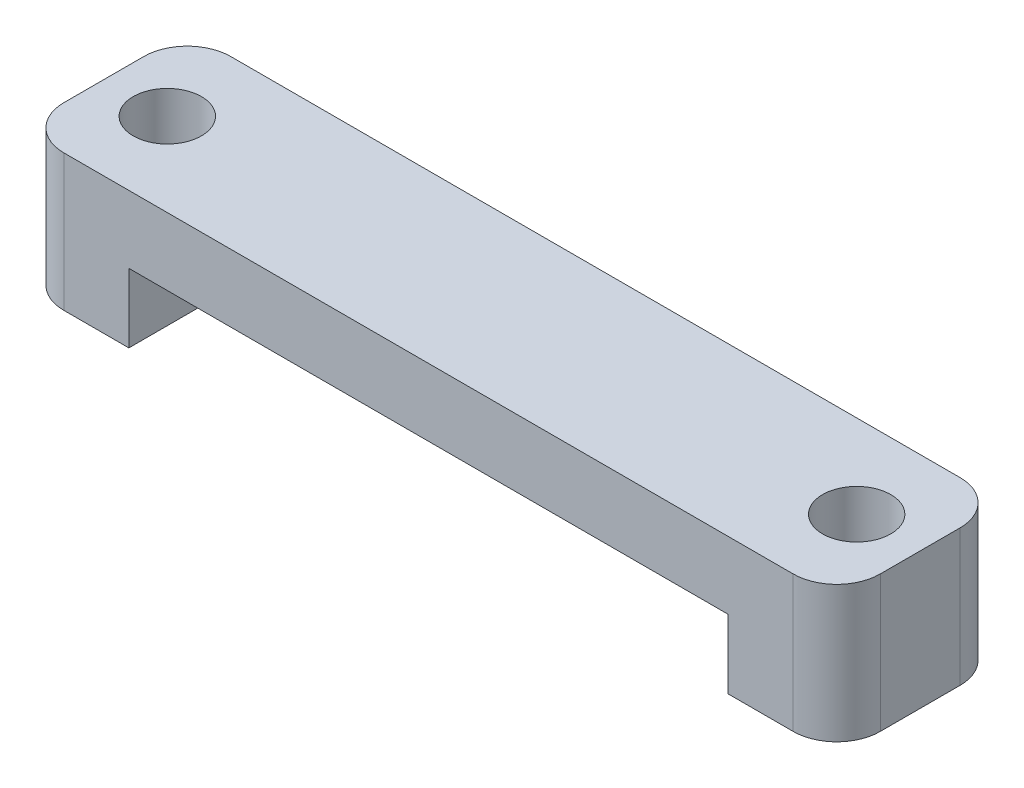
ISO-10303-21;
HEADER;
FILE_DESCRIPTION(('STEP AP214'),'2;1');
FILE_NAME('part.step','',(''),(''),'','','');
FILE_SCHEMA(('AUTOMOTIVE_DESIGN { 1 0 10303 214 1 1 1 1 }'));
ENDSEC;
DATA;
#1=APPLICATION_CONTEXT('core data for automotive mechanical design processes');
#2=APPLICATION_PROTOCOL_DEFINITION('international standard','automotive_design',2000,#1);
#3=PRODUCT_CONTEXT('',#1,'mechanical');
#4=PRODUCT('Part','Part','',(#3));
#5=PRODUCT_RELATED_PRODUCT_CATEGORY('part','',(#4));
#6=PRODUCT_DEFINITION_FORMATION('','',#4);
#7=PRODUCT_DEFINITION_CONTEXT('part definition',#1,'design');
#8=PRODUCT_DEFINITION('design','',#6,#7);
#9=PRODUCT_DEFINITION_SHAPE('','',#8);
#10=(LENGTH_UNIT() NAMED_UNIT(*) SI_UNIT(.MILLI.,.METRE.));
#11=(NAMED_UNIT(*) PLANE_ANGLE_UNIT() SI_UNIT($,.RADIAN.));
#12=(NAMED_UNIT(*) SI_UNIT($,.STERADIAN.) SOLID_ANGLE_UNIT());
#13=UNCERTAINTY_MEASURE_WITH_UNIT(LENGTH_MEASURE(1.E-05),#10,'distance_accuracy_value','');
#14=(GEOMETRIC_REPRESENTATION_CONTEXT(3) GLOBAL_UNCERTAINTY_ASSIGNED_CONTEXT((#13)) GLOBAL_UNIT_ASSIGNED_CONTEXT((#10,
#11,#12)) REPRESENTATION_CONTEXT('',''));
#15=CARTESIAN_POINT('',(0.,0.,0.));
#16=DIRECTION('',(0.,0.,1.));
#17=DIRECTION('',(1.,0.,0.));
#18=AXIS2_PLACEMENT_3D('',#15,#16,#17);
#19=CARTESIAN_POINT('',(-14.2875,0.,2.921));
#20=DIRECTION('',(0.,1.,0.));
#21=DIRECTION('',(0.,0.,1.));
#22=AXIS2_PLACEMENT_3D('',#19,#20,#21);
#23=PLANE('',#22);
#24=CARTESIAN_POINT('',(-12.065,0.,0.));
#25=DIRECTION('',(0.,1.,0.));
#26=DIRECTION('',(0.,0.,1.));
#27=AXIS2_PLACEMENT_3D('',#24,#25,#26);
#28=CIRCLE('',#27,1.1938);
#29=CARTESIAN_POINT('',(-12.065,0.,1.1938));
#30=VERTEX_POINT('',#29);
#31=EDGE_CURVE('E210',#30,#30,#28,.T.);
#32=ORIENTED_EDGE('',*,*,#31,.T.);
#33=EDGE_LOOP('',(#32));
#34=FACE_BOUND('',#33,.T.);
#35=DIRECTION('',(-1.,0.,0.));
#36=VECTOR('',#35,1.);
#37=CARTESIAN_POINT('',(-14.2875,0.,-2.921));
#38=LINE('',#37,#36);
#39=CARTESIAN_POINT('',(-10.4902,0.,-2.921));
#40=VERTEX_POINT('',#39);
#41=CARTESIAN_POINT('',(-12.7635,0.,-2.921));
#42=VERTEX_POINT('',#41);
#43=EDGE_CURVE('E139',#40,#42,#38,.T.);
#44=ORIENTED_EDGE('',*,*,#43,.F.);
#45=DIRECTION('',(0.,0.,1.));
#46=VECTOR('',#45,1.);
#47=CARTESIAN_POINT('',(-10.4902,0.,-2.921));
#48=LINE('',#47,#46);
#49=CARTESIAN_POINT('',(-10.4902,0.,2.921));
#50=VERTEX_POINT('',#49);
#51=EDGE_CURVE('E126',#40,#50,#48,.T.);
#52=ORIENTED_EDGE('',*,*,#51,.T.);
#53=DIRECTION('',(1.,0.,0.));
#54=VECTOR('',#53,1.);
#55=CARTESIAN_POINT('',(-14.2875,0.,2.921));
#56=LINE('',#55,#54);
#57=CARTESIAN_POINT('',(-12.7635,0.,2.921));
#58=VERTEX_POINT('',#57);
#59=EDGE_CURVE('E137',#58,#50,#56,.T.);
#60=ORIENTED_EDGE('',*,*,#59,.F.);
#61=CARTESIAN_POINT('',(-12.7635,0.,1.397));
#62=DIRECTION('',(0.,1.,0.));
#63=DIRECTION('',(0.,0.,1.));
#64=AXIS2_PLACEMENT_3D('',#61,#62,#63);
#65=CIRCLE('',#64,1.524);
#66=CARTESIAN_POINT('',(-14.2875,0.,1.397));
#67=VERTEX_POINT('',#66);
#68=EDGE_CURVE('E166',#58,#67,#65,.F.);
#69=ORIENTED_EDGE('',*,*,#68,.T.);
#70=DIRECTION('',(0.,0.,1.));
#71=VECTOR('',#70,1.);
#72=CARTESIAN_POINT('',(-14.2875,0.,-2.921));
#73=LINE('',#72,#71);
#74=CARTESIAN_POINT('',(-14.2875,0.,-1.397));
#75=VERTEX_POINT('',#74);
#76=EDGE_CURVE('E149',#75,#67,#73,.T.);
#77=ORIENTED_EDGE('',*,*,#76,.F.);
#78=CARTESIAN_POINT('',(-12.7635,0.,-1.397));
#79=DIRECTION('',(0.,1.,0.));
#80=DIRECTION('',(0.,0.,1.));
#81=AXIS2_PLACEMENT_3D('',#78,#79,#80);
#82=CIRCLE('',#81,1.524);
#83=EDGE_CURVE('E168',#75,#42,#82,.F.);
#84=ORIENTED_EDGE('',*,*,#83,.T.);
#85=EDGE_LOOP('',(#44,#52,#60,#69,#77,#84));
#86=FACE_BOUND('',#85,.T.);
#87=ADVANCED_FACE('F34',(#34,#86),#23,.F.);
#88=CARTESIAN_POINT('',(-14.2875,4.7752,2.921));
#89=DIRECTION('',(0.,1.,0.));
#90=DIRECTION('',(0.,0.,1.));
#91=AXIS2_PLACEMENT_3D('',#88,#89,#90);
#92=PLANE('',#91);
#93=CARTESIAN_POINT('',(12.065,4.7752,0.));
#94=DIRECTION('',(0.,1.,0.));
#95=DIRECTION('',(0.,0.,1.));
#96=AXIS2_PLACEMENT_3D('',#93,#94,#95);
#97=CIRCLE('',#96,1.1938);
#98=CARTESIAN_POINT('',(12.065,4.7752,1.1938));
#99=VERTEX_POINT('',#98);
#100=EDGE_CURVE('E200',#99,#99,#97,.T.);
#101=ORIENTED_EDGE('',*,*,#100,.F.);
#102=EDGE_LOOP('',(#101));
#103=FACE_BOUND('',#102,.T.);
#104=DIRECTION('',(0.,0.,-1.));
#105=VECTOR('',#104,1.);
#106=CARTESIAN_POINT('',(14.2875,4.7752,-2.921));
#107=LINE('',#106,#105);
#108=CARTESIAN_POINT('',(14.2875,4.7752,1.397));
#109=VERTEX_POINT('',#108);
#110=CARTESIAN_POINT('',(14.2875,4.7752,-1.397));
#111=VERTEX_POINT('',#110);
#112=EDGE_CURVE('E216',#109,#111,#107,.T.);
#113=ORIENTED_EDGE('',*,*,#112,.T.);
#114=CARTESIAN_POINT('',(12.7635,4.7752,-1.397));
#115=DIRECTION('',(0.,1.,0.));
#116=DIRECTION('',(0.,0.,1.));
#117=AXIS2_PLACEMENT_3D('',#114,#115,#116);
#118=CIRCLE('',#117,1.524);
#119=CARTESIAN_POINT('',(12.7635,4.7752,-2.921));
#120=VERTEX_POINT('',#119);
#121=EDGE_CURVE('E183',#111,#120,#118,.T.);
#122=ORIENTED_EDGE('',*,*,#121,.T.);
#123=DIRECTION('',(-1.,0.,0.));
#124=VECTOR('',#123,1.);
#125=CARTESIAN_POINT('',(-14.2875,4.7752,-2.921));
#126=LINE('',#125,#124);
#127=CARTESIAN_POINT('',(-12.7635,4.7752,-2.921));
#128=VERTEX_POINT('',#127);
#129=EDGE_CURVE('E160',#120,#128,#126,.T.);
#130=ORIENTED_EDGE('',*,*,#129,.T.);
#131=CARTESIAN_POINT('',(-12.7635,4.7752,-1.397));
#132=DIRECTION('',(0.,1.,0.));
#133=DIRECTION('',(0.,0.,1.));
#134=AXIS2_PLACEMENT_3D('',#131,#132,#133);
#135=CIRCLE('',#134,1.524);
#136=CARTESIAN_POINT('',(-14.2875,4.7752,-1.397));
#137=VERTEX_POINT('',#136);
#138=EDGE_CURVE('E181',#128,#137,#135,.T.);
#139=ORIENTED_EDGE('',*,*,#138,.T.);
#140=DIRECTION('',(0.,0.,1.));
#141=VECTOR('',#140,1.);
#142=CARTESIAN_POINT('',(-14.2875,4.7752,-2.921));
#143=LINE('',#142,#141);
#144=CARTESIAN_POINT('',(-14.2875,4.7752,1.397));
#145=VERTEX_POINT('',#144);
#146=EDGE_CURVE('E156',#137,#145,#143,.T.);
#147=ORIENTED_EDGE('',*,*,#146,.T.);
#148=CARTESIAN_POINT('',(-12.7635,4.7752,1.397));
#149=DIRECTION('',(0.,1.,0.));
#150=DIRECTION('',(0.,0.,1.));
#151=AXIS2_PLACEMENT_3D('',#148,#149,#150);
#152=CIRCLE('',#151,1.524);
#153=CARTESIAN_POINT('',(-12.7635,4.7752,2.921));
#154=VERTEX_POINT('',#153);
#155=EDGE_CURVE('E179',#145,#154,#152,.T.);
#156=ORIENTED_EDGE('',*,*,#155,.T.);
#157=DIRECTION('',(1.,0.,0.));
#158=VECTOR('',#157,1.);
#159=CARTESIAN_POINT('',(-14.2875,4.7752,2.921));
#160=LINE('',#159,#158);
#161=CARTESIAN_POINT('',(12.7635,4.7752,2.921));
#162=VERTEX_POINT('',#161);
#163=EDGE_CURVE('E214',#154,#162,#160,.T.);
#164=ORIENTED_EDGE('',*,*,#163,.T.);
#165=CARTESIAN_POINT('',(12.7635,4.7752,1.397));
#166=DIRECTION('',(0.,1.,0.));
#167=DIRECTION('',(0.,0.,1.));
#168=AXIS2_PLACEMENT_3D('',#165,#166,#167);
#169=CIRCLE('',#168,1.524);
#170=EDGE_CURVE('E177',#162,#109,#169,.T.);
#171=ORIENTED_EDGE('',*,*,#170,.T.);
#172=EDGE_LOOP('',(#113,#122,#130,#139,#147,#156,#164,#171));
#173=FACE_BOUND('',#172,.T.);
#174=CARTESIAN_POINT('',(-12.065,4.7752,0.));
#175=DIRECTION('',(0.,1.,0.));
#176=DIRECTION('',(0.,0.,1.));
#177=AXIS2_PLACEMENT_3D('',#174,#175,#176);
#178=CIRCLE('',#177,1.1938);
#179=CARTESIAN_POINT('',(-12.065,4.7752,1.1938));
#180=VERTEX_POINT('',#179);
#181=EDGE_CURVE('E207',#180,#180,#178,.T.);
#182=ORIENTED_EDGE('',*,*,#181,.F.);
#183=EDGE_LOOP('',(#182));
#184=FACE_BOUND('',#183,.T.);
#185=ADVANCED_FACE('F221',(#103,#173,#184),#92,.T.);
#186=CARTESIAN_POINT('',(12.065,0.,0.));
#187=DIRECTION('',(0.,1.,0.));
#188=DIRECTION('',(0.,0.,1.));
#189=AXIS2_PLACEMENT_3D('',#186,#187,#188);
#190=CIRCLE('',#189,1.1938);
#191=CARTESIAN_POINT('',(12.065,0.,1.1938));
#192=VERTEX_POINT('',#191);
#193=EDGE_CURVE('E202',#192,#192,#190,.T.);
#194=ORIENTED_EDGE('',*,*,#193,.T.);
#195=EDGE_LOOP('',(#194));
#196=FACE_BOUND('',#195,.T.);
#197=CARTESIAN_POINT('',(10.4902,0.,2.921));
#198=VERTEX_POINT('',#197);
#199=CARTESIAN_POINT('',(12.7635,0.,2.921));
#200=VERTEX_POINT('',#199);
#201=EDGE_CURVE('E145',#198,#200,#56,.T.);
#202=ORIENTED_EDGE('',*,*,#201,.F.);
#203=DIRECTION('',(0.,0.,1.));
#204=VECTOR('',#203,1.);
#205=CARTESIAN_POINT('',(10.4902,0.,-2.921));
#206=LINE('',#205,#204);
#207=CARTESIAN_POINT('',(10.4902,0.,-2.921));
#208=VERTEX_POINT('',#207);
#209=EDGE_CURVE('E140',#208,#198,#206,.T.);
#210=ORIENTED_EDGE('',*,*,#209,.F.);
#211=CARTESIAN_POINT('',(12.7635,0.,-2.921));
#212=VERTEX_POINT('',#211);
#213=EDGE_CURVE('E153',#212,#208,#38,.T.);
#214=ORIENTED_EDGE('',*,*,#213,.F.);
#215=CARTESIAN_POINT('',(12.7635,0.,-1.397));
#216=DIRECTION('',(0.,1.,0.));
#217=DIRECTION('',(0.,0.,1.));
#218=AXIS2_PLACEMENT_3D('',#215,#216,#217);
#219=CIRCLE('',#218,1.524);
#220=CARTESIAN_POINT('',(14.2875,0.,-1.397));
#221=VERTEX_POINT('',#220);
#222=EDGE_CURVE('E170',#212,#221,#219,.F.);
#223=ORIENTED_EDGE('',*,*,#222,.T.);
#224=DIRECTION('',(0.,0.,-1.));
#225=VECTOR('',#224,1.);
#226=CARTESIAN_POINT('',(14.2875,0.,-2.921));
#227=LINE('',#226,#225);
#228=CARTESIAN_POINT('',(14.2875,0.,1.397));
#229=VERTEX_POINT('',#228);
#230=EDGE_CURVE('E144',#229,#221,#227,.T.);
#231=ORIENTED_EDGE('',*,*,#230,.F.);
#232=CARTESIAN_POINT('',(12.7635,0.,1.397));
#233=DIRECTION('',(0.,1.,0.));
#234=DIRECTION('',(0.,0.,1.));
#235=AXIS2_PLACEMENT_3D('',#232,#233,#234);
#236=CIRCLE('',#235,1.524);
#237=EDGE_CURVE('E163',#229,#200,#236,.F.);
#238=ORIENTED_EDGE('',*,*,#237,.T.);
#239=EDGE_LOOP('',(#202,#210,#214,#223,#231,#238));
#240=FACE_BOUND('',#239,.T.);
#241=ADVANCED_FACE('F263',(#196,#240),#23,.F.);
#242=CARTESIAN_POINT('',(-14.2875,4.7752,-2.921));
#243=DIRECTION('',(1.,0.,0.));
#244=DIRECTION('',(0.,0.,-1.));
#245=AXIS2_PLACEMENT_3D('',#242,#243,#244);
#246=PLANE('',#245);
#247=ORIENTED_EDGE('',*,*,#146,.F.);
#248=DIRECTION('',(0.,-1.,0.));
#249=VECTOR('',#248,1.);
#250=CARTESIAN_POINT('',(-14.2875,4.7752,-1.397));
#251=LINE('',#250,#249);
#252=EDGE_CURVE('E187',#137,#75,#251,.T.);
#253=ORIENTED_EDGE('',*,*,#252,.T.);
#254=ORIENTED_EDGE('',*,*,#76,.T.);
#255=DIRECTION('',(0.,-1.,0.));
#256=VECTOR('',#255,1.);
#257=CARTESIAN_POINT('',(-14.2875,4.7752,1.397));
#258=LINE('',#257,#256);
#259=EDGE_CURVE('E185',#67,#145,#258,.F.);
#260=ORIENTED_EDGE('',*,*,#259,.T.);
#261=EDGE_LOOP('',(#247,#253,#254,#260));
#262=FACE_BOUND('',#261,.T.);
#263=ADVANCED_FACE('F194',(#262),#246,.F.);
#264=CARTESIAN_POINT('',(-14.2875,4.7752,2.921));
#265=DIRECTION('',(0.,0.,-1.));
#266=DIRECTION('',(-1.,0.,0.));
#267=AXIS2_PLACEMENT_3D('',#264,#265,#266);
#268=PLANE('',#267);
#269=ORIENTED_EDGE('',*,*,#59,.T.);
#270=DIRECTION('',(0.,-1.,0.));
#271=VECTOR('',#270,1.);
#272=CARTESIAN_POINT('',(-10.4902,2.413,2.921));
#273=LINE('',#272,#271);
#274=CARTESIAN_POINT('',(-10.4902,2.413,2.921));
#275=VERTEX_POINT('',#274);
#276=EDGE_CURVE('E122',#275,#50,#273,.T.);
#277=ORIENTED_EDGE('',*,*,#276,.F.);
#278=DIRECTION('',(-1.,0.,0.));
#279=VECTOR('',#278,1.);
#280=CARTESIAN_POINT('',(-10.4902,2.413,2.921));
#281=LINE('',#280,#279);
#282=CARTESIAN_POINT('',(10.4902,2.413,2.921));
#283=VERTEX_POINT('',#282);
#284=EDGE_CURVE('E231',#283,#275,#281,.T.);
#285=ORIENTED_EDGE('',*,*,#284,.F.);
#286=DIRECTION('',(0.,1.,0.));
#287=VECTOR('',#286,1.);
#288=CARTESIAN_POINT('',(10.4902,2.413,2.921));
#289=LINE('',#288,#287);
#290=EDGE_CURVE('E132',#198,#283,#289,.T.);
#291=ORIENTED_EDGE('',*,*,#290,.F.);
#292=ORIENTED_EDGE('',*,*,#201,.T.);
#293=DIRECTION('',(0.,-1.,0.));
#294=VECTOR('',#293,1.);
#295=CARTESIAN_POINT('',(12.7635,4.7752,2.921));
#296=LINE('',#295,#294);
#297=EDGE_CURVE('E42',#200,#162,#296,.F.);
#298=ORIENTED_EDGE('',*,*,#297,.T.);
#299=ORIENTED_EDGE('',*,*,#163,.F.);
#300=DIRECTION('',(0.,-1.,0.));
#301=VECTOR('',#300,1.);
#302=CARTESIAN_POINT('',(-12.7635,4.7752,2.921));
#303=LINE('',#302,#301);
#304=EDGE_CURVE('E11',#154,#58,#303,.T.);
#305=ORIENTED_EDGE('',*,*,#304,.T.);
#306=EDGE_LOOP('',(#269,#277,#285,#291,#292,#298,#299,#305));
#307=FACE_BOUND('',#306,.T.);
#308=ADVANCED_FACE('F142',(#307),#268,.F.);
#309=CARTESIAN_POINT('',(14.2875,4.7752,-2.921));
#310=DIRECTION('',(-1.,0.,0.));
#311=DIRECTION('',(0.,0.,1.));
#312=AXIS2_PLACEMENT_3D('',#309,#310,#311);
#313=PLANE('',#312);
#314=ORIENTED_EDGE('',*,*,#230,.T.);
#315=DIRECTION('',(0.,-1.,0.));
#316=VECTOR('',#315,1.);
#317=CARTESIAN_POINT('',(14.2875,4.7752,-1.397));
#318=LINE('',#317,#316);
#319=EDGE_CURVE('E175',#221,#111,#318,.F.);
#320=ORIENTED_EDGE('',*,*,#319,.T.);
#321=ORIENTED_EDGE('',*,*,#112,.F.);
#322=DIRECTION('',(0.,-1.,0.));
#323=VECTOR('',#322,1.);
#324=CARTESIAN_POINT('',(14.2875,4.7752,1.397));
#325=LINE('',#324,#323);
#326=EDGE_CURVE('E172',#109,#229,#325,.T.);
#327=ORIENTED_EDGE('',*,*,#326,.T.);
#328=EDGE_LOOP('',(#314,#320,#321,#327));
#329=FACE_BOUND('',#328,.T.);
#330=ADVANCED_FACE('F288',(#329),#313,.F.);
#331=CARTESIAN_POINT('',(-14.2875,4.7752,-2.921));
#332=DIRECTION('',(0.,0.,1.));
#333=DIRECTION('',(1.,0.,0.));
#334=AXIS2_PLACEMENT_3D('',#331,#332,#333);
#335=PLANE('',#334);
#336=DIRECTION('',(-1.,0.,0.));
#337=VECTOR('',#336,1.);
#338=CARTESIAN_POINT('',(-10.4902,2.413,-2.921));
#339=LINE('',#338,#337);
#340=CARTESIAN_POINT('',(10.4902,2.413,-2.921));
#341=VERTEX_POINT('',#340);
#342=CARTESIAN_POINT('',(-10.4902,2.413,-2.921));
#343=VERTEX_POINT('',#342);
#344=EDGE_CURVE('E49',#341,#343,#339,.T.);
#345=ORIENTED_EDGE('',*,*,#344,.T.);
#346=DIRECTION('',(0.,-1.,0.));
#347=VECTOR('',#346,1.);
#348=CARTESIAN_POINT('',(-10.4902,2.413,-2.921));
#349=LINE('',#348,#347);
#350=EDGE_CURVE('E228',#343,#40,#349,.T.);
#351=ORIENTED_EDGE('',*,*,#350,.T.);
#352=ORIENTED_EDGE('',*,*,#43,.T.);
#353=DIRECTION('',(0.,-1.,0.));
#354=VECTOR('',#353,1.);
#355=CARTESIAN_POINT('',(-12.7635,4.7752,-2.921));
#356=LINE('',#355,#354);
#357=EDGE_CURVE('E157',#42,#128,#356,.F.);
#358=ORIENTED_EDGE('',*,*,#357,.T.);
#359=ORIENTED_EDGE('',*,*,#129,.F.);
#360=DIRECTION('',(0.,-1.,0.));
#361=VECTOR('',#360,1.);
#362=CARTESIAN_POINT('',(12.7635,4.7752,-2.921));
#363=LINE('',#362,#361);
#364=EDGE_CURVE('E159',#120,#212,#363,.T.);
#365=ORIENTED_EDGE('',*,*,#364,.T.);
#366=ORIENTED_EDGE('',*,*,#213,.T.);
#367=DIRECTION('',(0.,1.,0.));
#368=VECTOR('',#367,1.);
#369=CARTESIAN_POINT('',(10.4902,2.413,-2.921));
#370=LINE('',#369,#368);
#371=EDGE_CURVE('E230',#208,#341,#370,.T.);
#372=ORIENTED_EDGE('',*,*,#371,.T.);
#373=EDGE_LOOP('',(#345,#351,#352,#358,#359,#365,#366,#372));
#374=FACE_BOUND('',#373,.T.);
#375=ADVANCED_FACE('F227',(#374),#335,.F.);
#376=CARTESIAN_POINT('',(12.065,4.7752,0.));
#377=DIRECTION('',(0.,-1.,0.));
#378=DIRECTION('',(0.,0.,-1.));
#379=AXIS2_PLACEMENT_3D('',#376,#377,#378);
#380=CYLINDRICAL_SURFACE('',#379,1.1938);
#381=ORIENTED_EDGE('',*,*,#100,.T.);
#382=EDGE_LOOP('',(#381));
#383=FACE_BOUND('',#382,.T.);
#384=ORIENTED_EDGE('',*,*,#193,.F.);
#385=EDGE_LOOP('',(#384));
#386=FACE_BOUND('',#385,.T.);
#387=ADVANCED_FACE('F251',(#383,#386),#380,.F.);
#388=CARTESIAN_POINT('',(-12.065,4.7752,0.));
#389=DIRECTION('',(0.,-1.,0.));
#390=DIRECTION('',(0.,0.,-1.));
#391=AXIS2_PLACEMENT_3D('',#388,#389,#390);
#392=CYLINDRICAL_SURFACE('',#391,1.1938);
#393=ORIENTED_EDGE('',*,*,#181,.T.);
#394=EDGE_LOOP('',(#393));
#395=FACE_BOUND('',#394,.T.);
#396=ORIENTED_EDGE('',*,*,#31,.F.);
#397=EDGE_LOOP('',(#396));
#398=FACE_BOUND('',#397,.T.);
#399=ADVANCED_FACE('F248',(#395,#398),#392,.F.);
#400=CARTESIAN_POINT('',(12.7635,4.7752,-1.397));
#401=DIRECTION('',(0.,-1.,0.));
#402=DIRECTION('',(0.,0.,-1.));
#403=AXIS2_PLACEMENT_3D('',#400,#401,#402);
#404=CYLINDRICAL_SURFACE('',#403,1.524);
#405=ORIENTED_EDGE('',*,*,#121,.F.);
#406=ORIENTED_EDGE('',*,*,#319,.F.);
#407=ORIENTED_EDGE('',*,*,#222,.F.);
#408=ORIENTED_EDGE('',*,*,#364,.F.);
#409=EDGE_LOOP('',(#405,#406,#407,#408));
#410=FACE_BOUND('',#409,.T.);
#411=ADVANCED_FACE('F250',(#410),#404,.T.);
#412=CARTESIAN_POINT('',(-12.7635,4.7752,-1.397));
#413=DIRECTION('',(0.,-1.,0.));
#414=DIRECTION('',(0.,0.,-1.));
#415=AXIS2_PLACEMENT_3D('',#412,#413,#414);
#416=CYLINDRICAL_SURFACE('',#415,1.524);
#417=ORIENTED_EDGE('',*,*,#138,.F.);
#418=ORIENTED_EDGE('',*,*,#357,.F.);
#419=ORIENTED_EDGE('',*,*,#83,.F.);
#420=ORIENTED_EDGE('',*,*,#252,.F.);
#421=EDGE_LOOP('',(#417,#418,#419,#420));
#422=FACE_BOUND('',#421,.T.);
#423=ADVANCED_FACE('F226',(#422),#416,.T.);
#424=CARTESIAN_POINT('',(-12.7635,4.7752,1.397));
#425=DIRECTION('',(0.,-1.,0.));
#426=DIRECTION('',(0.,0.,-1.));
#427=AXIS2_PLACEMENT_3D('',#424,#425,#426);
#428=CYLINDRICAL_SURFACE('',#427,1.524);
#429=ORIENTED_EDGE('',*,*,#155,.F.);
#430=ORIENTED_EDGE('',*,*,#259,.F.);
#431=ORIENTED_EDGE('',*,*,#68,.F.);
#432=ORIENTED_EDGE('',*,*,#304,.F.);
#433=EDGE_LOOP('',(#429,#430,#431,#432));
#434=FACE_BOUND('',#433,.T.);
#435=ADVANCED_FACE('F295',(#434),#428,.T.);
#436=CARTESIAN_POINT('',(12.7635,4.7752,1.397));
#437=DIRECTION('',(0.,-1.,0.));
#438=DIRECTION('',(0.,0.,-1.));
#439=AXIS2_PLACEMENT_3D('',#436,#437,#438);
#440=CYLINDRICAL_SURFACE('',#439,1.524);
#441=ORIENTED_EDGE('',*,*,#170,.F.);
#442=ORIENTED_EDGE('',*,*,#297,.F.);
#443=ORIENTED_EDGE('',*,*,#237,.F.);
#444=ORIENTED_EDGE('',*,*,#326,.F.);
#445=EDGE_LOOP('',(#441,#442,#443,#444));
#446=FACE_BOUND('',#445,.T.);
#447=ADVANCED_FACE('F36',(#446),#440,.T.);
#448=CARTESIAN_POINT('',(-10.4902,2.413,-2.921));
#449=DIRECTION('',(-1.,0.,0.));
#450=DIRECTION('',(0.,0.,1.));
#451=AXIS2_PLACEMENT_3D('',#448,#449,#450);
#452=PLANE('',#451);
#453=ORIENTED_EDGE('',*,*,#51,.F.);
#454=ORIENTED_EDGE('',*,*,#350,.F.);
#455=DIRECTION('',(0.,0.,1.));
#456=VECTOR('',#455,1.);
#457=CARTESIAN_POINT('',(-10.4902,2.413,-2.921));
#458=LINE('',#457,#456);
#459=EDGE_CURVE('E128',#343,#275,#458,.T.);
#460=ORIENTED_EDGE('',*,*,#459,.T.);
#461=ORIENTED_EDGE('',*,*,#276,.T.);
#462=EDGE_LOOP('',(#453,#454,#460,#461));
#463=FACE_BOUND('',#462,.T.);
#464=ADVANCED_FACE('F124',(#463),#452,.F.);
#465=CARTESIAN_POINT('',(-10.4902,2.413,-2.921));
#466=DIRECTION('',(0.,1.,0.));
#467=DIRECTION('',(0.,0.,1.));
#468=AXIS2_PLACEMENT_3D('',#465,#466,#467);
#469=PLANE('',#468);
#470=ORIENTED_EDGE('',*,*,#459,.F.);
#471=ORIENTED_EDGE('',*,*,#344,.F.);
#472=DIRECTION('',(0.,0.,1.));
#473=VECTOR('',#472,1.);
#474=CARTESIAN_POINT('',(10.4902,2.413,-2.921));
#475=LINE('',#474,#473);
#476=EDGE_CURVE('E239',#341,#283,#475,.T.);
#477=ORIENTED_EDGE('',*,*,#476,.T.);
#478=ORIENTED_EDGE('',*,*,#284,.T.);
#479=EDGE_LOOP('',(#470,#471,#477,#478));
#480=FACE_BOUND('',#479,.T.);
#481=ADVANCED_FACE('F381',(#480),#469,.F.);
#482=CARTESIAN_POINT('',(10.4902,2.413,-2.921));
#483=DIRECTION('',(1.,0.,0.));
#484=DIRECTION('',(0.,0.,-1.));
#485=AXIS2_PLACEMENT_3D('',#482,#483,#484);
#486=PLANE('',#485);
#487=ORIENTED_EDGE('',*,*,#476,.F.);
#488=ORIENTED_EDGE('',*,*,#371,.F.);
#489=ORIENTED_EDGE('',*,*,#209,.T.);
#490=ORIENTED_EDGE('',*,*,#290,.T.);
#491=EDGE_LOOP('',(#487,#488,#489,#490));
#492=FACE_BOUND('',#491,.T.);
#493=ADVANCED_FACE('F285',(#492),#486,.F.);
#494=CLOSED_SHELL('',(#87,#185,#241,#263,#308,#330,#375,#387,#399,#411,#423,#435,#447,#464,#481,#493));
#495=MANIFOLD_SOLID_BREP('B2',#494);
#496=ADVANCED_BREP_SHAPE_REPRESENTATION('',(#18,#495),#14);
#497=SHAPE_DEFINITION_REPRESENTATION(#9,#496);
ENDSEC;
END-ISO-10303-21;
